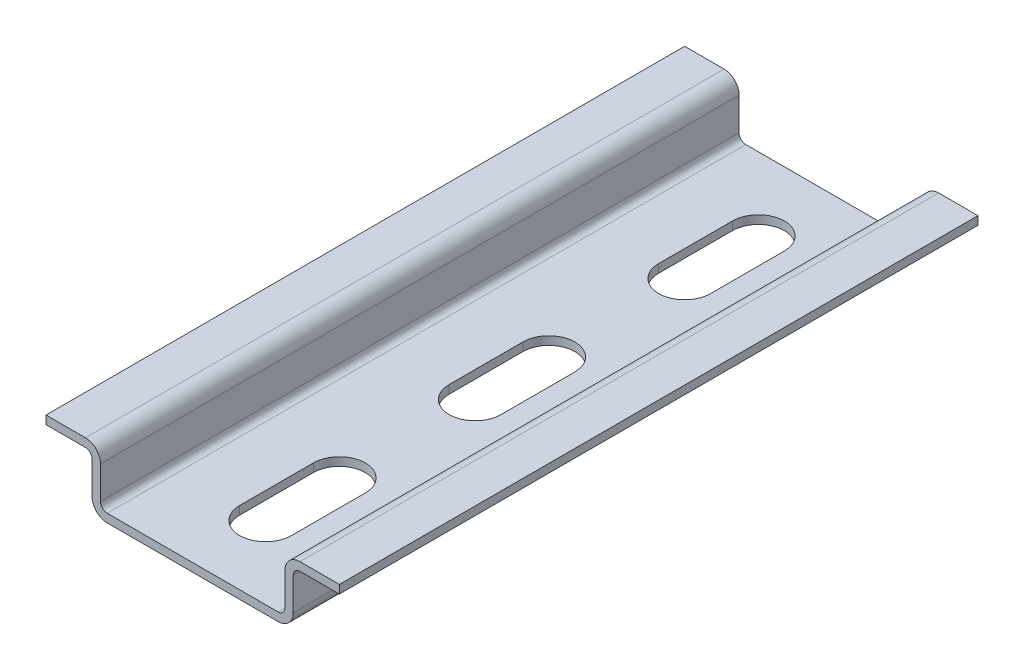
ISO-10303-21;
HEADER;
FILE_DESCRIPTION(('STEP AP214'),'2;1');
FILE_NAME('part.step','',(''),(''),'','','');
FILE_SCHEMA(('AUTOMOTIVE_DESIGN { 1 0 10303 214 1 1 1 1 }'));
ENDSEC;
DATA;
#1=APPLICATION_CONTEXT('core data for automotive mechanical design processes');
#2=APPLICATION_PROTOCOL_DEFINITION('international standard','automotive_design',2000,#1);
#3=PRODUCT_CONTEXT('',#1,'mechanical');
#4=PRODUCT('Part','Part','',(#3));
#5=PRODUCT_RELATED_PRODUCT_CATEGORY('part','',(#4));
#6=PRODUCT_DEFINITION_FORMATION('','',#4);
#7=PRODUCT_DEFINITION_CONTEXT('part definition',#1,'design');
#8=PRODUCT_DEFINITION('design','',#6,#7);
#9=PRODUCT_DEFINITION_SHAPE('','',#8);
#10=(LENGTH_UNIT() NAMED_UNIT(*) SI_UNIT(.MILLI.,.METRE.));
#11=(NAMED_UNIT(*) PLANE_ANGLE_UNIT() SI_UNIT($,.RADIAN.));
#12=(NAMED_UNIT(*) SI_UNIT($,.STERADIAN.) SOLID_ANGLE_UNIT());
#13=UNCERTAINTY_MEASURE_WITH_UNIT(LENGTH_MEASURE(1.E-05),#10,'distance_accuracy_value','');
#14=(GEOMETRIC_REPRESENTATION_CONTEXT(3) GLOBAL_UNCERTAINTY_ASSIGNED_CONTEXT((#13)) GLOBAL_UNIT_ASSIGNED_CONTEXT((#10,
#11,#12)) REPRESENTATION_CONTEXT('',''));
#15=CARTESIAN_POINT('',(0.,0.,0.));
#16=DIRECTION('',(0.,0.,1.));
#17=DIRECTION('',(1.,0.,0.));
#18=AXIS2_PLACEMENT_3D('',#15,#16,#17);
#19=CARTESIAN_POINT('',(-12.,1.00000000000003,-254.));
#20=DIRECTION('',(0.,1.,0.));
#21=DIRECTION('',(-1.,0.,0.));
#22=AXIS2_PLACEMENT_3D('',#19,#20,#21);
#23=PLANE('',#22);
#24=CARTESIAN_POINT('',(0.,1.00000000000001,-4.4));
#25=DIRECTION('',(0.,1.,0.));
#26=DIRECTION('',(1.,0.,0.));
#27=AXIS2_PLACEMENT_3D('',#24,#25,#26);
#28=CIRCLE('',#27,3.1);
#29=CARTESIAN_POINT('',(3.1,1.00000000000001,-4.4));
#30=VERTEX_POINT('',#29);
#31=CARTESIAN_POINT('',(-3.1,1.00000000000002,-4.39999999999999));
#32=VERTEX_POINT('',#31);
#33=EDGE_CURVE('E425',#30,#32,#28,.T.);
#34=ORIENTED_EDGE('',*,*,#33,.F.);
#35=DIRECTION('',(0.,0.,-1.));
#36=VECTOR('',#35,1.);
#37=CARTESIAN_POINT('',(3.1,1.00000000000001,-4.4));
#38=LINE('',#37,#36);
#39=CARTESIAN_POINT('',(3.1,1.00000000000001,4.4));
#40=VERTEX_POINT('',#39);
#41=EDGE_CURVE('E436',#40,#30,#38,.T.);
#42=ORIENTED_EDGE('',*,*,#41,.F.);
#43=CARTESIAN_POINT('',(0.,1.00000000000001,4.4));
#44=DIRECTION('',(0.,1.,0.));
#45=DIRECTION('',(-1.,0.,0.));
#46=AXIS2_PLACEMENT_3D('',#43,#44,#45);
#47=CIRCLE('',#46,3.1);
#48=CARTESIAN_POINT('',(-3.1,1.00000000000002,4.4));
#49=VERTEX_POINT('',#48);
#50=EDGE_CURVE('E450',#49,#40,#47,.T.);
#51=ORIENTED_EDGE('',*,*,#50,.F.);
#52=DIRECTION('',(0.,0.,1.));
#53=VECTOR('',#52,1.);
#54=CARTESIAN_POINT('',(-3.1,1.00000000000002,4.4));
#55=LINE('',#54,#53);
#56=EDGE_CURVE('E447',#32,#49,#55,.T.);
#57=ORIENTED_EDGE('',*,*,#56,.F.);
#58=EDGE_LOOP('',(#34,#42,#51,#57));
#59=FACE_BOUND('',#58,.T.);
#60=CARTESIAN_POINT('',(0.,1.00000000000001,-29.4));
#61=DIRECTION('',(0.,1.,0.));
#62=DIRECTION('',(1.,0.,0.));
#63=AXIS2_PLACEMENT_3D('',#60,#61,#62);
#64=CIRCLE('',#63,3.1);
#65=CARTESIAN_POINT('',(3.1,1.00000000000001,-29.4));
#66=VERTEX_POINT('',#65);
#67=CARTESIAN_POINT('',(-3.1,1.00000000000002,-29.4));
#68=VERTEX_POINT('',#67);
#69=EDGE_CURVE('E393',#66,#68,#64,.T.);
#70=ORIENTED_EDGE('',*,*,#69,.F.);
#71=DIRECTION('',(0.,0.,-1.));
#72=VECTOR('',#71,1.);
#73=CARTESIAN_POINT('',(3.1,1.00000000000001,-29.4));
#74=LINE('',#73,#72);
#75=CARTESIAN_POINT('',(3.1,1.00000000000001,-20.6));
#76=VERTEX_POINT('',#75);
#77=EDGE_CURVE('E404',#76,#66,#74,.T.);
#78=ORIENTED_EDGE('',*,*,#77,.F.);
#79=CARTESIAN_POINT('',(0.,1.00000000000001,-20.6));
#80=DIRECTION('',(0.,1.,0.));
#81=DIRECTION('',(-1.,0.,0.));
#82=AXIS2_PLACEMENT_3D('',#79,#80,#81);
#83=CIRCLE('',#82,3.1);
#84=CARTESIAN_POINT('',(-3.1,1.00000000000002,-20.6));
#85=VERTEX_POINT('',#84);
#86=EDGE_CURVE('E418',#85,#76,#83,.T.);
#87=ORIENTED_EDGE('',*,*,#86,.F.);
#88=DIRECTION('',(0.,0.,1.));
#89=VECTOR('',#88,1.);
#90=CARTESIAN_POINT('',(-3.1,1.00000000000002,-20.6));
#91=LINE('',#90,#89);
#92=EDGE_CURVE('E415',#68,#85,#91,.T.);
#93=ORIENTED_EDGE('',*,*,#92,.F.);
#94=EDGE_LOOP('',(#70,#78,#87,#93));
#95=FACE_BOUND('',#94,.T.);
#96=DIRECTION('',(0.,0.,1.));
#97=VECTOR('',#96,1.);
#98=CARTESIAN_POINT('',(3.1,1.00000000000001,29.4));
#99=LINE('',#98,#97);
#100=CARTESIAN_POINT('',(3.1,1.00000000000001,20.6));
#101=VERTEX_POINT('',#100);
#102=CARTESIAN_POINT('',(3.1,1.00000000000001,29.4));
#103=VERTEX_POINT('',#102);
#104=EDGE_CURVE('E382',#101,#103,#99,.T.);
#105=ORIENTED_EDGE('',*,*,#104,.T.);
#106=CARTESIAN_POINT('',(0.,1.00000000000001,29.4));
#107=DIRECTION('',(0.,-1.,0.));
#108=DIRECTION('',(1.,0.,0.));
#109=AXIS2_PLACEMENT_3D('',#106,#107,#108);
#110=CIRCLE('',#109,3.1);
#111=CARTESIAN_POINT('',(-3.1,1.00000000000002,29.4));
#112=VERTEX_POINT('',#111);
#113=EDGE_CURVE('E368',#103,#112,#110,.T.);
#114=ORIENTED_EDGE('',*,*,#113,.T.);
#115=DIRECTION('',(0.,0.,-1.));
#116=VECTOR('',#115,1.);
#117=CARTESIAN_POINT('',(-3.1,1.00000000000002,20.6));
#118=LINE('',#117,#116);
#119=CARTESIAN_POINT('',(-3.1,1.00000000000002,20.6));
#120=VERTEX_POINT('',#119);
#121=EDGE_CURVE('E372',#112,#120,#118,.T.);
#122=ORIENTED_EDGE('',*,*,#121,.T.);
#123=CARTESIAN_POINT('',(0.,1.00000000000001,20.6));
#124=DIRECTION('',(0.,-1.,0.));
#125=DIRECTION('',(-1.,0.,0.));
#126=AXIS2_PLACEMENT_3D('',#123,#124,#125);
#127=CIRCLE('',#126,3.1);
#128=EDGE_CURVE('E385',#120,#101,#127,.T.);
#129=ORIENTED_EDGE('',*,*,#128,.T.);
#130=EDGE_LOOP('',(#105,#114,#122,#129));
#131=FACE_BOUND('',#130,.T.);
#132=DIRECTION('',(0.,0.,1.));
#133=VECTOR('',#132,1.);
#134=CARTESIAN_POINT('',(-10.2,1.00000000000003,254.));
#135=LINE('',#134,#133);
#136=CARTESIAN_POINT('',(-10.2,1.00000000000003,-38.1));
#137=VERTEX_POINT('',#136);
#138=CARTESIAN_POINT('',(-10.2,1.00000000000003,38.1));
#139=VERTEX_POINT('',#138);
#140=EDGE_CURVE('E488',#137,#139,#135,.T.);
#141=ORIENTED_EDGE('',*,*,#140,.T.);
#142=DIRECTION('',(1.,0.,0.));
#143=VECTOR('',#142,1.);
#144=CARTESIAN_POINT('',(-12.,1.00000000000003,38.1));
#145=LINE('',#144,#143);
#146=CARTESIAN_POINT('',(10.2,1.,38.1));
#147=VERTEX_POINT('',#146);
#148=EDGE_CURVE('E341',#139,#147,#145,.T.);
#149=ORIENTED_EDGE('',*,*,#148,.T.);
#150=DIRECTION('',(0.,0.,1.));
#151=VECTOR('',#150,1.);
#152=CARTESIAN_POINT('',(10.2,1.,-254.));
#153=LINE('',#152,#151);
#154=CARTESIAN_POINT('',(10.2,1.,-38.1));
#155=VERTEX_POINT('',#154);
#156=EDGE_CURVE('E491',#147,#155,#153,.F.);
#157=ORIENTED_EDGE('',*,*,#156,.T.);
#158=DIRECTION('',(-1.,0.,0.));
#159=VECTOR('',#158,1.);
#160=CARTESIAN_POINT('',(-12.,1.00000000000003,-38.1));
#161=LINE('',#160,#159);
#162=EDGE_CURVE('E307',#155,#137,#161,.T.);
#163=ORIENTED_EDGE('',*,*,#162,.T.);
#164=EDGE_LOOP('',(#141,#149,#157,#163));
#165=FACE_BOUND('',#164,.T.);
#166=ADVANCED_FACE('F34',(#59,#95,#131,#165),#23,.T.);
#167=CARTESIAN_POINT('',(-12.,0.,-254.));
#168=DIRECTION('',(0.,1.,0.));
#169=DIRECTION('',(-1.,0.,0.));
#170=AXIS2_PLACEMENT_3D('',#167,#168,#169);
#171=PLANE('',#170);
#172=DIRECTION('',(0.,0.,-1.));
#173=VECTOR('',#172,1.);
#174=CARTESIAN_POINT('',(3.1,0.,-4.4));
#175=LINE('',#174,#173);
#176=CARTESIAN_POINT('',(3.1,0.,4.4));
#177=VERTEX_POINT('',#176);
#178=CARTESIAN_POINT('',(3.1,0.,-4.4));
#179=VERTEX_POINT('',#178);
#180=EDGE_CURVE('E442',#177,#179,#175,.T.);
#181=ORIENTED_EDGE('',*,*,#180,.T.);
#182=CARTESIAN_POINT('',(0.,0.,-4.4));
#183=DIRECTION('',(0.,1.,0.));
#184=DIRECTION('',(1.,0.,0.));
#185=AXIS2_PLACEMENT_3D('',#182,#183,#184);
#186=CIRCLE('',#185,3.1);
#187=CARTESIAN_POINT('',(-3.1,0.,-4.4));
#188=VERTEX_POINT('',#187);
#189=EDGE_CURVE('E432',#179,#188,#186,.T.);
#190=ORIENTED_EDGE('',*,*,#189,.T.);
#191=DIRECTION('',(0.,0.,1.));
#192=VECTOR('',#191,1.);
#193=CARTESIAN_POINT('',(-3.1,0.,4.4));
#194=LINE('',#193,#192);
#195=CARTESIAN_POINT('',(-3.1,0.,4.40000000000001));
#196=VERTEX_POINT('',#195);
#197=EDGE_CURVE('E435',#188,#196,#194,.T.);
#198=ORIENTED_EDGE('',*,*,#197,.T.);
#199=CARTESIAN_POINT('',(0.,0.,4.4));
#200=DIRECTION('',(0.,1.,0.));
#201=DIRECTION('',(-1.,0.,0.));
#202=AXIS2_PLACEMENT_3D('',#199,#200,#201);
#203=CIRCLE('',#202,3.1);
#204=EDGE_CURVE('E439',#196,#177,#203,.T.);
#205=ORIENTED_EDGE('',*,*,#204,.T.);
#206=EDGE_LOOP('',(#181,#190,#198,#205));
#207=FACE_BOUND('',#206,.T.);
#208=DIRECTION('',(0.,0.,-1.));
#209=VECTOR('',#208,1.);
#210=CARTESIAN_POINT('',(3.1,0.,-29.4));
#211=LINE('',#210,#209);
#212=CARTESIAN_POINT('',(3.1,0.,-20.6));
#213=VERTEX_POINT('',#212);
#214=CARTESIAN_POINT('',(3.1,0.,-29.4));
#215=VERTEX_POINT('',#214);
#216=EDGE_CURVE('E410',#213,#215,#211,.T.);
#217=ORIENTED_EDGE('',*,*,#216,.T.);
#218=CARTESIAN_POINT('',(0.,0.,-29.4));
#219=DIRECTION('',(0.,1.,0.));
#220=DIRECTION('',(1.,0.,0.));
#221=AXIS2_PLACEMENT_3D('',#218,#219,#220);
#222=CIRCLE('',#221,3.1);
#223=CARTESIAN_POINT('',(-3.1,0.,-29.4));
#224=VERTEX_POINT('',#223);
#225=EDGE_CURVE('E400',#215,#224,#222,.T.);
#226=ORIENTED_EDGE('',*,*,#225,.T.);
#227=DIRECTION('',(0.,0.,1.));
#228=VECTOR('',#227,1.);
#229=CARTESIAN_POINT('',(-3.1,0.,-20.6));
#230=LINE('',#229,#228);
#231=CARTESIAN_POINT('',(-3.1,0.,-20.6));
#232=VERTEX_POINT('',#231);
#233=EDGE_CURVE('E403',#224,#232,#230,.T.);
#234=ORIENTED_EDGE('',*,*,#233,.T.);
#235=CARTESIAN_POINT('',(0.,0.,-20.6));
#236=DIRECTION('',(0.,1.,0.));
#237=DIRECTION('',(-1.,0.,0.));
#238=AXIS2_PLACEMENT_3D('',#235,#236,#237);
#239=CIRCLE('',#238,3.1);
#240=EDGE_CURVE('E407',#232,#213,#239,.T.);
#241=ORIENTED_EDGE('',*,*,#240,.T.);
#242=EDGE_LOOP('',(#217,#226,#234,#241));
#243=FACE_BOUND('',#242,.T.);
#244=CARTESIAN_POINT('',(0.,0.,29.4));
#245=DIRECTION('',(0.,-1.,0.));
#246=DIRECTION('',(1.,0.,0.));
#247=AXIS2_PLACEMENT_3D('',#244,#245,#246);
#248=CIRCLE('',#247,3.1);
#249=CARTESIAN_POINT('',(3.1,0.,29.4));
#250=VERTEX_POINT('',#249);
#251=CARTESIAN_POINT('',(-3.1,0.,29.4));
#252=VERTEX_POINT('',#251);
#253=EDGE_CURVE('E369',#250,#252,#248,.T.);
#254=ORIENTED_EDGE('',*,*,#253,.F.);
#255=DIRECTION('',(0.,0.,1.));
#256=VECTOR('',#255,1.);
#257=CARTESIAN_POINT('',(3.1,0.,29.4));
#258=LINE('',#257,#256);
#259=CARTESIAN_POINT('',(3.1,0.,20.6));
#260=VERTEX_POINT('',#259);
#261=EDGE_CURVE('E371',#260,#250,#258,.T.);
#262=ORIENTED_EDGE('',*,*,#261,.F.);
#263=CARTESIAN_POINT('',(0.,0.,20.6));
#264=DIRECTION('',(0.,-1.,0.));
#265=DIRECTION('',(-1.,0.,0.));
#266=AXIS2_PLACEMENT_3D('',#263,#264,#265);
#267=CIRCLE('',#266,3.1);
#268=CARTESIAN_POINT('',(-3.1,0.,20.6));
#269=VERTEX_POINT('',#268);
#270=EDGE_CURVE('E374',#269,#260,#267,.T.);
#271=ORIENTED_EDGE('',*,*,#270,.F.);
#272=DIRECTION('',(0.,0.,-1.));
#273=VECTOR('',#272,1.);
#274=CARTESIAN_POINT('',(-3.1,0.,20.6));
#275=LINE('',#274,#273);
#276=EDGE_CURVE('E377',#252,#269,#275,.T.);
#277=ORIENTED_EDGE('',*,*,#276,.F.);
#278=EDGE_LOOP('',(#254,#262,#271,#277));
#279=FACE_BOUND('',#278,.T.);
#280=DIRECTION('',(1.,0.,0.));
#281=VECTOR('',#280,1.);
#282=CARTESIAN_POINT('',(51.2266068298276,0.,38.1));
#283=LINE('',#282,#281);
#284=CARTESIAN_POINT('',(-10.2,0.,38.1));
#285=VERTEX_POINT('',#284);
#286=CARTESIAN_POINT('',(10.2,0.,38.1));
#287=VERTEX_POINT('',#286);
#288=EDGE_CURVE('E243',#285,#287,#283,.T.);
#289=ORIENTED_EDGE('',*,*,#288,.F.);
#290=DIRECTION('',(0.,0.,1.));
#291=VECTOR('',#290,1.);
#292=CARTESIAN_POINT('',(-10.2,0.,-254.));
#293=LINE('',#292,#291);
#294=CARTESIAN_POINT('',(-10.2,0.,-38.1));
#295=VERTEX_POINT('',#294);
#296=EDGE_CURVE('E258',#285,#295,#293,.F.);
#297=ORIENTED_EDGE('',*,*,#296,.T.);
#298=DIRECTION('',(-1.,0.,0.));
#299=VECTOR('',#298,1.);
#300=CARTESIAN_POINT('',(51.2266068298276,0.,-38.1));
#301=LINE('',#300,#299);
#302=CARTESIAN_POINT('',(10.2,0.,-38.1));
#303=VERTEX_POINT('',#302);
#304=EDGE_CURVE('E262',#303,#295,#301,.T.);
#305=ORIENTED_EDGE('',*,*,#304,.F.);
#306=DIRECTION('',(0.,0.,1.));
#307=VECTOR('',#306,1.);
#308=CARTESIAN_POINT('',(10.2,0.,-254.));
#309=LINE('',#308,#307);
#310=EDGE_CURVE('E260',#303,#287,#309,.T.);
#311=ORIENTED_EDGE('',*,*,#310,.T.);
#312=EDGE_LOOP('',(#289,#297,#305,#311));
#313=FACE_BOUND('',#312,.T.);
#314=ADVANCED_FACE('F256',(#207,#243,#279,#313),#171,.F.);
#315=CARTESIAN_POINT('',(-12.,7.50000000000003,-254.));
#316=DIRECTION('',(0.,1.,0.));
#317=DIRECTION('',(-1.,0.,0.));
#318=AXIS2_PLACEMENT_3D('',#315,#316,#317);
#319=PLANE('',#318);
#320=DIRECTION('',(0.,0.,1.));
#321=VECTOR('',#320,1.);
#322=CARTESIAN_POINT('',(-17.5,7.50000000000003,-254.));
#323=LINE('',#322,#321);
#324=CARTESIAN_POINT('',(-17.5,7.5,-38.1));
#325=VERTEX_POINT('',#324);
#326=CARTESIAN_POINT('',(-17.5,7.5,38.1));
#327=VERTEX_POINT('',#326);
#328=EDGE_CURVE('E295',#325,#327,#323,.T.);
#329=ORIENTED_EDGE('',*,*,#328,.T.);
#330=DIRECTION('',(1.,0.,0.));
#331=VECTOR('',#330,1.);
#332=CARTESIAN_POINT('',(51.2266068298276,7.49999999999999,38.1));
#333=LINE('',#332,#331);
#334=CARTESIAN_POINT('',(-12.8,7.5,38.1));
#335=VERTEX_POINT('',#334);
#336=EDGE_CURVE('E294',#327,#335,#333,.T.);
#337=ORIENTED_EDGE('',*,*,#336,.T.);
#338=DIRECTION('',(0.,0.,1.));
#339=VECTOR('',#338,1.);
#340=CARTESIAN_POINT('',(-12.8,7.50000000000003,-254.));
#341=LINE('',#340,#339);
#342=CARTESIAN_POINT('',(-12.8,7.50000000000003,-38.1));
#343=VERTEX_POINT('',#342);
#344=EDGE_CURVE('E283',#335,#343,#341,.F.);
#345=ORIENTED_EDGE('',*,*,#344,.T.);
#346=DIRECTION('',(-1.,0.,0.));
#347=VECTOR('',#346,1.);
#348=CARTESIAN_POINT('',(51.2266068298276,7.49999999999999,-38.1));
#349=LINE('',#348,#347);
#350=EDGE_CURVE('E56',#343,#325,#349,.T.);
#351=ORIENTED_EDGE('',*,*,#350,.T.);
#352=EDGE_LOOP('',(#329,#337,#345,#351));
#353=FACE_BOUND('',#352,.T.);
#354=ADVANCED_FACE('F292',(#353),#319,.T.);
#355=CARTESIAN_POINT('',(-11.,0.,-254.));
#356=DIRECTION('',(1.,0.,0.));
#357=DIRECTION('',(0.,0.,-1.));
#358=AXIS2_PLACEMENT_3D('',#355,#356,#357);
#359=PLANE('',#358);
#360=DIRECTION('',(0.,0.,1.));
#361=VECTOR('',#360,1.);
#362=CARTESIAN_POINT('',(-11.,5.70000000000003,-254.));
#363=LINE('',#362,#361);
#364=CARTESIAN_POINT('',(-11.,5.70000000000003,-38.1));
#365=VERTEX_POINT('',#364);
#366=CARTESIAN_POINT('',(-11.,5.70000000000003,38.1));
#367=VERTEX_POINT('',#366);
#368=EDGE_CURVE('E280',#365,#367,#363,.T.);
#369=ORIENTED_EDGE('',*,*,#368,.T.);
#370=DIRECTION('',(0.,-1.,0.));
#371=VECTOR('',#370,1.);
#372=CARTESIAN_POINT('',(-11.,0.,38.1));
#373=LINE('',#372,#371);
#374=CARTESIAN_POINT('',(-11.,1.80000000000003,38.1));
#375=VERTEX_POINT('',#374);
#376=EDGE_CURVE('E49',#367,#375,#373,.T.);
#377=ORIENTED_EDGE('',*,*,#376,.T.);
#378=DIRECTION('',(0.,0.,1.));
#379=VECTOR('',#378,1.);
#380=CARTESIAN_POINT('',(-11.,1.80000000000003,-254.));
#381=LINE('',#380,#379);
#382=CARTESIAN_POINT('',(-11.,1.80000000000003,-38.1));
#383=VERTEX_POINT('',#382);
#384=EDGE_CURVE('E494',#375,#383,#381,.F.);
#385=ORIENTED_EDGE('',*,*,#384,.T.);
#386=DIRECTION('',(0.,1.,0.));
#387=VECTOR('',#386,1.);
#388=CARTESIAN_POINT('',(-11.,0.,-38.1));
#389=LINE('',#388,#387);
#390=EDGE_CURVE('E261',#383,#365,#389,.T.);
#391=ORIENTED_EDGE('',*,*,#390,.T.);
#392=EDGE_LOOP('',(#369,#377,#385,#391));
#393=FACE_BOUND('',#392,.T.);
#394=ADVANCED_FACE('F521',(#393),#359,.T.);
#395=CARTESIAN_POINT('',(11.,0.,-254.));
#396=DIRECTION('',(-1.,0.,0.));
#397=DIRECTION('',(0.,0.,1.));
#398=AXIS2_PLACEMENT_3D('',#395,#396,#397);
#399=PLANE('',#398);
#400=DIRECTION('',(0.,0.,1.));
#401=VECTOR('',#400,1.);
#402=CARTESIAN_POINT('',(11.,1.8,254.));
#403=LINE('',#402,#401);
#404=CARTESIAN_POINT('',(11.,1.8,-38.1));
#405=VERTEX_POINT('',#404);
#406=CARTESIAN_POINT('',(11.,1.8,38.1));
#407=VERTEX_POINT('',#406);
#408=EDGE_CURVE('E485',#405,#407,#403,.T.);
#409=ORIENTED_EDGE('',*,*,#408,.T.);
#410=DIRECTION('',(0.,1.,0.));
#411=VECTOR('',#410,1.);
#412=CARTESIAN_POINT('',(11.,0.,38.1));
#413=LINE('',#412,#411);
#414=CARTESIAN_POINT('',(11.,5.7,38.1));
#415=VERTEX_POINT('',#414);
#416=EDGE_CURVE('E346',#407,#415,#413,.T.);
#417=ORIENTED_EDGE('',*,*,#416,.T.);
#418=DIRECTION('',(0.,0.,1.));
#419=VECTOR('',#418,1.);
#420=CARTESIAN_POINT('',(11.,5.7,-254.));
#421=LINE('',#420,#419);
#422=CARTESIAN_POINT('',(11.,5.7,-38.1));
#423=VERTEX_POINT('',#422);
#424=EDGE_CURVE('E267',#415,#423,#421,.F.);
#425=ORIENTED_EDGE('',*,*,#424,.T.);
#426=DIRECTION('',(0.,-1.,0.));
#427=VECTOR('',#426,1.);
#428=CARTESIAN_POINT('',(11.,0.,-38.1));
#429=LINE('',#428,#427);
#430=EDGE_CURVE('E312',#423,#405,#429,.T.);
#431=ORIENTED_EDGE('',*,*,#430,.T.);
#432=EDGE_LOOP('',(#409,#417,#425,#431));
#433=FACE_BOUND('',#432,.T.);
#434=ADVANCED_FACE('F507',(#433),#399,.T.);
#435=CARTESIAN_POINT('',(12.,7.5,-254.));
#436=DIRECTION('',(0.,1.,0.));
#437=DIRECTION('',(-1.,0.,0.));
#438=AXIS2_PLACEMENT_3D('',#435,#436,#437);
#439=PLANE('',#438);
#440=DIRECTION('',(0.,0.,1.));
#441=VECTOR('',#440,1.);
#442=CARTESIAN_POINT('',(12.8,7.5,-254.));
#443=LINE('',#442,#441);
#444=CARTESIAN_POINT('',(12.8,7.5,-38.1));
#445=VERTEX_POINT('',#444);
#446=CARTESIAN_POINT('',(12.8,7.5,38.1));
#447=VERTEX_POINT('',#446);
#448=EDGE_CURVE('E272',#445,#447,#443,.T.);
#449=ORIENTED_EDGE('',*,*,#448,.T.);
#450=CARTESIAN_POINT('',(17.5,7.5,38.1));
#451=VERTEX_POINT('',#450);
#452=EDGE_CURVE('E297',#447,#451,#333,.T.);
#453=ORIENTED_EDGE('',*,*,#452,.T.);
#454=DIRECTION('',(0.,0.,1.));
#455=VECTOR('',#454,1.);
#456=CARTESIAN_POINT('',(17.5,7.5,-254.));
#457=LINE('',#456,#455);
#458=CARTESIAN_POINT('',(17.5,7.5,-38.1));
#459=VERTEX_POINT('',#458);
#460=EDGE_CURVE('E463',#459,#451,#457,.T.);
#461=ORIENTED_EDGE('',*,*,#460,.F.);
#462=EDGE_CURVE('E301',#459,#445,#349,.T.);
#463=ORIENTED_EDGE('',*,*,#462,.T.);
#464=EDGE_LOOP('',(#449,#453,#461,#463));
#465=FACE_BOUND('',#464,.T.);
#466=ADVANCED_FACE('F500',(#465),#439,.T.);
#467=CARTESIAN_POINT('',(17.5,7.5,-254.));
#468=DIRECTION('',(-1.,0.,0.));
#469=DIRECTION('',(0.,0.,1.));
#470=AXIS2_PLACEMENT_3D('',#467,#468,#469);
#471=PLANE('',#470);
#472=DIRECTION('',(0.,1.,0.));
#473=VECTOR('',#472,1.);
#474=CARTESIAN_POINT('',(17.5,7.5,38.1));
#475=LINE('',#474,#473);
#476=CARTESIAN_POINT('',(17.5,6.5,38.1));
#477=VERTEX_POINT('',#476);
#478=EDGE_CURVE('E366',#477,#451,#475,.T.);
#479=ORIENTED_EDGE('',*,*,#478,.F.);
#480=DIRECTION('',(0.,0.,1.));
#481=VECTOR('',#480,1.);
#482=CARTESIAN_POINT('',(17.5,6.5,-254.));
#483=LINE('',#482,#481);
#484=CARTESIAN_POINT('',(17.5,6.5,-38.1));
#485=VERTEX_POINT('',#484);
#486=EDGE_CURVE('E467',#485,#477,#483,.T.);
#487=ORIENTED_EDGE('',*,*,#486,.F.);
#488=DIRECTION('',(0.,-1.,0.));
#489=VECTOR('',#488,1.);
#490=CARTESIAN_POINT('',(17.5,7.5,-38.1));
#491=LINE('',#490,#489);
#492=EDGE_CURVE('E336',#459,#485,#491,.T.);
#493=ORIENTED_EDGE('',*,*,#492,.F.);
#494=ORIENTED_EDGE('',*,*,#460,.T.);
#495=EDGE_LOOP('',(#479,#487,#493,#494));
#496=FACE_BOUND('',#495,.T.);
#497=ADVANCED_FACE('F528',(#496),#471,.F.);
#498=CARTESIAN_POINT('',(12.,6.5,-254.));
#499=DIRECTION('',(0.,1.,0.));
#500=DIRECTION('',(-1.,0.,0.));
#501=AXIS2_PLACEMENT_3D('',#498,#499,#500);
#502=PLANE('',#501);
#503=DIRECTION('',(1.,0.,0.));
#504=VECTOR('',#503,1.);
#505=CARTESIAN_POINT('',(12.,6.5,38.1));
#506=LINE('',#505,#504);
#507=CARTESIAN_POINT('',(12.8,6.5,38.1));
#508=VERTEX_POINT('',#507);
#509=EDGE_CURVE('E364',#508,#477,#506,.T.);
#510=ORIENTED_EDGE('',*,*,#509,.F.);
#511=DIRECTION('',(0.,0.,1.));
#512=VECTOR('',#511,1.);
#513=CARTESIAN_POINT('',(12.8,6.5,-254.));
#514=LINE('',#513,#512);
#515=CARTESIAN_POINT('',(12.8,6.5,-38.1));
#516=VERTEX_POINT('',#515);
#517=EDGE_CURVE('E476',#508,#516,#514,.F.);
#518=ORIENTED_EDGE('',*,*,#517,.T.);
#519=DIRECTION('',(-1.,0.,0.));
#520=VECTOR('',#519,1.);
#521=CARTESIAN_POINT('',(12.,6.5,-38.1));
#522=LINE('',#521,#520);
#523=EDGE_CURVE('E334',#485,#516,#522,.T.);
#524=ORIENTED_EDGE('',*,*,#523,.F.);
#525=ORIENTED_EDGE('',*,*,#486,.T.);
#526=EDGE_LOOP('',(#510,#518,#524,#525));
#527=FACE_BOUND('',#526,.T.);
#528=ADVANCED_FACE('F531',(#527),#502,.F.);
#529=CARTESIAN_POINT('',(12.,0.,-254.));
#530=DIRECTION('',(-1.,0.,0.));
#531=DIRECTION('',(0.,0.,1.));
#532=AXIS2_PLACEMENT_3D('',#529,#530,#531);
#533=PLANE('',#532);
#534=DIRECTION('',(0.,1.,0.));
#535=VECTOR('',#534,1.);
#536=CARTESIAN_POINT('',(12.,0.,38.1));
#537=LINE('',#536,#535);
#538=CARTESIAN_POINT('',(12.,1.8,38.1));
#539=VERTEX_POINT('',#538);
#540=CARTESIAN_POINT('',(12.,5.7,38.1));
#541=VERTEX_POINT('',#540);
#542=EDGE_CURVE('E360',#539,#541,#537,.T.);
#543=ORIENTED_EDGE('',*,*,#542,.F.);
#544=DIRECTION('',(0.,0.,1.));
#545=VECTOR('',#544,1.);
#546=CARTESIAN_POINT('',(12.,1.8,-254.));
#547=LINE('',#546,#545);
#548=CARTESIAN_POINT('',(12.,1.8,-38.1));
#549=VERTEX_POINT('',#548);
#550=EDGE_CURVE('E269',#539,#549,#547,.F.);
#551=ORIENTED_EDGE('',*,*,#550,.T.);
#552=DIRECTION('',(0.,-1.,0.));
#553=VECTOR('',#552,1.);
#554=CARTESIAN_POINT('',(12.,0.,-38.1));
#555=LINE('',#554,#553);
#556=CARTESIAN_POINT('',(12.,5.7,-38.1));
#557=VERTEX_POINT('',#556);
#558=EDGE_CURVE('E330',#557,#549,#555,.T.);
#559=ORIENTED_EDGE('',*,*,#558,.F.);
#560=DIRECTION('',(0.,0.,1.));
#561=VECTOR('',#560,1.);
#562=CARTESIAN_POINT('',(12.,5.7,254.));
#563=LINE('',#562,#561);
#564=EDGE_CURVE('E466',#557,#541,#563,.T.);
#565=ORIENTED_EDGE('',*,*,#564,.T.);
#566=EDGE_LOOP('',(#543,#551,#559,#565));
#567=FACE_BOUND('',#566,.T.);
#568=ADVANCED_FACE('F541',(#567),#533,.F.);
#569=CARTESIAN_POINT('',(-12.,0.,-254.));
#570=DIRECTION('',(1.,0.,0.));
#571=DIRECTION('',(0.,0.,-1.));
#572=AXIS2_PLACEMENT_3D('',#569,#570,#571);
#573=PLANE('',#572);
#574=DIRECTION('',(0.,-1.,0.));
#575=VECTOR('',#574,1.);
#576=CARTESIAN_POINT('',(-12.,0.,38.1));
#577=LINE('',#576,#575);
#578=CARTESIAN_POINT('',(-12.,5.70000000000003,38.1));
#579=VERTEX_POINT('',#578);
#580=CARTESIAN_POINT('',(-12.,1.80000000000003,38.1));
#581=VERTEX_POINT('',#580);
#582=EDGE_CURVE('E246',#579,#581,#577,.T.);
#583=ORIENTED_EDGE('',*,*,#582,.F.);
#584=DIRECTION('',(0.,0.,1.));
#585=VECTOR('',#584,1.);
#586=CARTESIAN_POINT('',(-12.,5.70000000000003,-254.));
#587=LINE('',#586,#585);
#588=CARTESIAN_POINT('',(-12.,5.70000000000003,-38.1));
#589=VERTEX_POINT('',#588);
#590=EDGE_CURVE('E482',#579,#589,#587,.F.);
#591=ORIENTED_EDGE('',*,*,#590,.T.);
#592=DIRECTION('',(0.,1.,0.));
#593=VECTOR('',#592,1.);
#594=CARTESIAN_POINT('',(-12.,0.,-38.1));
#595=LINE('',#594,#593);
#596=CARTESIAN_POINT('',(-12.,1.80000000000003,-38.1));
#597=VERTEX_POINT('',#596);
#598=EDGE_CURVE('E319',#597,#589,#595,.T.);
#599=ORIENTED_EDGE('',*,*,#598,.F.);
#600=DIRECTION('',(0.,0.,1.));
#601=VECTOR('',#600,1.);
#602=CARTESIAN_POINT('',(-12.,1.80000000000003,-254.));
#603=LINE('',#602,#601);
#604=EDGE_CURVE('E278',#597,#581,#603,.T.);
#605=ORIENTED_EDGE('',*,*,#604,.T.);
#606=EDGE_LOOP('',(#583,#591,#599,#605));
#607=FACE_BOUND('',#606,.T.);
#608=ADVANCED_FACE('F574',(#607),#573,.F.);
#609=CARTESIAN_POINT('',(-12.,6.50000000000003,-254.));
#610=DIRECTION('',(0.,1.,0.));
#611=DIRECTION('',(-1.,0.,0.));
#612=AXIS2_PLACEMENT_3D('',#609,#610,#611);
#613=PLANE('',#612);
#614=DIRECTION('',(1.,0.,0.));
#615=VECTOR('',#614,1.);
#616=CARTESIAN_POINT('',(-12.,6.50000000000003,38.1));
#617=LINE('',#616,#615);
#618=CARTESIAN_POINT('',(-17.5,6.50000000000003,38.1));
#619=VERTEX_POINT('',#618);
#620=CARTESIAN_POINT('',(-12.8,6.50000000000003,38.1));
#621=VERTEX_POINT('',#620);
#622=EDGE_CURVE('E354',#619,#621,#617,.T.);
#623=ORIENTED_EDGE('',*,*,#622,.F.);
#624=DIRECTION('',(0.,0.,1.));
#625=VECTOR('',#624,1.);
#626=CARTESIAN_POINT('',(-17.5,6.50000000000003,-254.));
#627=LINE('',#626,#625);
#628=CARTESIAN_POINT('',(-17.5,6.50000000000003,-38.1));
#629=VERTEX_POINT('',#628);
#630=EDGE_CURVE('E470',#629,#619,#627,.T.);
#631=ORIENTED_EDGE('',*,*,#630,.F.);
#632=DIRECTION('',(-1.,0.,0.));
#633=VECTOR('',#632,1.);
#634=CARTESIAN_POINT('',(-12.,6.50000000000003,-38.1));
#635=LINE('',#634,#633);
#636=CARTESIAN_POINT('',(-12.8,6.50000000000003,-38.1));
#637=VERTEX_POINT('',#636);
#638=EDGE_CURVE('E323',#637,#629,#635,.T.);
#639=ORIENTED_EDGE('',*,*,#638,.F.);
#640=DIRECTION('',(0.,0.,1.));
#641=VECTOR('',#640,1.);
#642=CARTESIAN_POINT('',(-12.8,6.50000000000003,254.));
#643=LINE('',#642,#641);
#644=EDGE_CURVE('E479',#637,#621,#643,.T.);
#645=ORIENTED_EDGE('',*,*,#644,.T.);
#646=EDGE_LOOP('',(#623,#631,#639,#645));
#647=FACE_BOUND('',#646,.T.);
#648=ADVANCED_FACE('F578',(#647),#613,.F.);
#649=CARTESIAN_POINT('',(-17.5,6.50000000000003,-254.));
#650=DIRECTION('',(1.,0.,0.));
#651=DIRECTION('',(0.,0.,-1.));
#652=AXIS2_PLACEMENT_3D('',#649,#650,#651);
#653=PLANE('',#652);
#654=DIRECTION('',(0.,-1.,0.));
#655=VECTOR('',#654,1.);
#656=CARTESIAN_POINT('',(-17.5,6.50000000000003,38.1));
#657=LINE('',#656,#655);
#658=EDGE_CURVE('E356',#327,#619,#657,.T.);
#659=ORIENTED_EDGE('',*,*,#658,.F.);
#660=ORIENTED_EDGE('',*,*,#328,.F.);
#661=DIRECTION('',(0.,1.,0.));
#662=VECTOR('',#661,1.);
#663=CARTESIAN_POINT('',(-17.5,6.50000000000003,-38.1));
#664=LINE('',#663,#662);
#665=EDGE_CURVE('E325',#629,#325,#664,.T.);
#666=ORIENTED_EDGE('',*,*,#665,.F.);
#667=ORIENTED_EDGE('',*,*,#630,.T.);
#668=EDGE_LOOP('',(#659,#660,#666,#667));
#669=FACE_BOUND('',#668,.T.);
#670=ADVANCED_FACE('F582',(#669),#653,.F.);
#671=CARTESIAN_POINT('',(12.8,5.7,-254.));
#672=DIRECTION('',(0.,0.,-1.));
#673=DIRECTION('',(-1.,0.,0.));
#674=AXIS2_PLACEMENT_3D('',#671,#672,#673);
#675=CYLINDRICAL_SURFACE('',#674,0.8);
#676=CARTESIAN_POINT('',(12.8,5.7,38.1));
#677=DIRECTION('',(0.,0.,1.));
#678=DIRECTION('',(1.,0.,0.));
#679=AXIS2_PLACEMENT_3D('',#676,#677,#678);
#680=CIRCLE('',#679,0.8);
#681=EDGE_CURVE('E362',#541,#508,#680,.F.);
#682=ORIENTED_EDGE('',*,*,#681,.F.);
#683=ORIENTED_EDGE('',*,*,#564,.F.);
#684=CARTESIAN_POINT('',(12.8,5.7,-38.1));
#685=DIRECTION('',(0.,0.,-1.));
#686=DIRECTION('',(-1.,0.,0.));
#687=AXIS2_PLACEMENT_3D('',#684,#685,#686);
#688=CIRCLE('',#687,0.8);
#689=EDGE_CURVE('E332',#516,#557,#688,.F.);
#690=ORIENTED_EDGE('',*,*,#689,.F.);
#691=ORIENTED_EDGE('',*,*,#517,.F.);
#692=EDGE_LOOP('',(#682,#683,#690,#691));
#693=FACE_BOUND('',#692,.T.);
#694=ADVANCED_FACE('F538',(#693),#675,.F.);
#695=CARTESIAN_POINT('',(-12.8,5.70000000000003,-254.));
#696=DIRECTION('',(0.,0.,-1.));
#697=DIRECTION('',(-1.,0.,0.));
#698=AXIS2_PLACEMENT_3D('',#695,#696,#697);
#699=CYLINDRICAL_SURFACE('',#698,0.8);
#700=CARTESIAN_POINT('',(-12.8,5.70000000000003,38.1));
#701=DIRECTION('',(0.,0.,1.));
#702=DIRECTION('',(1.,0.,0.));
#703=AXIS2_PLACEMENT_3D('',#700,#701,#702);
#704=CIRCLE('',#703,0.8);
#705=EDGE_CURVE('E352',#621,#579,#704,.F.);
#706=ORIENTED_EDGE('',*,*,#705,.F.);
#707=ORIENTED_EDGE('',*,*,#644,.F.);
#708=CARTESIAN_POINT('',(-12.8,5.70000000000003,-38.1));
#709=DIRECTION('',(0.,0.,-1.));
#710=DIRECTION('',(-1.,0.,0.));
#711=AXIS2_PLACEMENT_3D('',#708,#709,#710);
#712=CIRCLE('',#711,0.8);
#713=EDGE_CURVE('E321',#589,#637,#712,.F.);
#714=ORIENTED_EDGE('',*,*,#713,.F.);
#715=ORIENTED_EDGE('',*,*,#590,.F.);
#716=EDGE_LOOP('',(#706,#707,#714,#715));
#717=FACE_BOUND('',#716,.T.);
#718=ADVANCED_FACE('F591',(#717),#699,.F.);
#719=CARTESIAN_POINT('',(10.2,1.8,-254.));
#720=DIRECTION('',(0.,0.,-1.));
#721=DIRECTION('',(-1.,0.,0.));
#722=AXIS2_PLACEMENT_3D('',#719,#720,#721);
#723=CYLINDRICAL_SURFACE('',#722,0.8);
#724=CARTESIAN_POINT('',(10.2,1.8,38.1));
#725=DIRECTION('',(0.,0.,1.));
#726=DIRECTION('',(1.,0.,0.));
#727=AXIS2_PLACEMENT_3D('',#724,#725,#726);
#728=CIRCLE('',#727,0.8);
#729=EDGE_CURVE('E344',#407,#147,#728,.F.);
#730=ORIENTED_EDGE('',*,*,#729,.F.);
#731=ORIENTED_EDGE('',*,*,#408,.F.);
#732=CARTESIAN_POINT('',(10.2,1.8,-38.1));
#733=DIRECTION('',(0.,0.,-1.));
#734=DIRECTION('',(-1.,0.,0.));
#735=AXIS2_PLACEMENT_3D('',#732,#733,#734);
#736=CIRCLE('',#735,0.8);
#737=EDGE_CURVE('E310',#155,#405,#736,.F.);
#738=ORIENTED_EDGE('',*,*,#737,.F.);
#739=ORIENTED_EDGE('',*,*,#156,.F.);
#740=EDGE_LOOP('',(#730,#731,#738,#739));
#741=FACE_BOUND('',#740,.T.);
#742=ADVANCED_FACE('F511',(#741),#723,.F.);
#743=CARTESIAN_POINT('',(-10.2,1.80000000000003,-254.));
#744=DIRECTION('',(0.,0.,-1.));
#745=DIRECTION('',(-1.,0.,0.));
#746=AXIS2_PLACEMENT_3D('',#743,#744,#745);
#747=CYLINDRICAL_SURFACE('',#746,0.8);
#748=CARTESIAN_POINT('',(-10.2,1.80000000000003,38.1));
#749=DIRECTION('',(0.,0.,1.));
#750=DIRECTION('',(1.,0.,0.));
#751=AXIS2_PLACEMENT_3D('',#748,#749,#750);
#752=CIRCLE('',#751,0.8);
#753=EDGE_CURVE('E339',#139,#375,#752,.F.);
#754=ORIENTED_EDGE('',*,*,#753,.F.);
#755=ORIENTED_EDGE('',*,*,#140,.F.);
#756=CARTESIAN_POINT('',(-10.2,1.80000000000003,-38.1));
#757=DIRECTION('',(0.,0.,-1.));
#758=DIRECTION('',(-1.,0.,0.));
#759=AXIS2_PLACEMENT_3D('',#756,#757,#758);
#760=CIRCLE('',#759,0.8);
#761=EDGE_CURVE('E305',#383,#137,#760,.F.);
#762=ORIENTED_EDGE('',*,*,#761,.F.);
#763=ORIENTED_EDGE('',*,*,#384,.F.);
#764=EDGE_LOOP('',(#754,#755,#762,#763));
#765=FACE_BOUND('',#764,.T.);
#766=ADVANCED_FACE('F518',(#765),#747,.F.);
#767=CARTESIAN_POINT('',(12.8,5.7,-254.));
#768=DIRECTION('',(0.,0.,1.));
#769=DIRECTION('',(1.,0.,0.));
#770=AXIS2_PLACEMENT_3D('',#767,#768,#769);
#771=CYLINDRICAL_SURFACE('',#770,1.8);
#772=ORIENTED_EDGE('',*,*,#424,.F.);
#773=CARTESIAN_POINT('',(12.8,5.7,38.1));
#774=DIRECTION('',(0.,0.,1.));
#775=DIRECTION('',(1.,0.,0.));
#776=AXIS2_PLACEMENT_3D('',#773,#774,#775);
#777=CIRCLE('',#776,1.8);
#778=EDGE_CURVE('E251',#415,#447,#777,.F.);
#779=ORIENTED_EDGE('',*,*,#778,.T.);
#780=ORIENTED_EDGE('',*,*,#448,.F.);
#781=CARTESIAN_POINT('',(12.8,5.7,-38.1));
#782=DIRECTION('',(0.,0.,-1.));
#783=DIRECTION('',(-1.,0.,0.));
#784=AXIS2_PLACEMENT_3D('',#781,#782,#783);
#785=CIRCLE('',#784,1.8);
#786=EDGE_CURVE('E315',#445,#423,#785,.F.);
#787=ORIENTED_EDGE('',*,*,#786,.T.);
#788=EDGE_LOOP('',(#772,#779,#780,#787));
#789=FACE_BOUND('',#788,.T.);
#790=ADVANCED_FACE('F504',(#789),#771,.T.);
#791=CARTESIAN_POINT('',(10.2,1.8,-254.));
#792=DIRECTION('',(0.,0.,1.));
#793=DIRECTION('',(1.,0.,0.));
#794=AXIS2_PLACEMENT_3D('',#791,#792,#793);
#795=CYLINDRICAL_SURFACE('',#794,1.8);
#796=ORIENTED_EDGE('',*,*,#550,.F.);
#797=CARTESIAN_POINT('',(10.2,1.8,38.1));
#798=DIRECTION('',(0.,0.,1.));
#799=DIRECTION('',(1.,0.,0.));
#800=AXIS2_PLACEMENT_3D('',#797,#798,#799);
#801=CIRCLE('',#800,1.8);
#802=EDGE_CURVE('E358',#539,#287,#801,.F.);
#803=ORIENTED_EDGE('',*,*,#802,.T.);
#804=ORIENTED_EDGE('',*,*,#310,.F.);
#805=CARTESIAN_POINT('',(10.2,1.8,-38.1));
#806=DIRECTION('',(0.,0.,-1.));
#807=DIRECTION('',(-1.,0.,0.));
#808=AXIS2_PLACEMENT_3D('',#805,#806,#807);
#809=CIRCLE('',#808,1.8);
#810=EDGE_CURVE('E327',#303,#549,#809,.F.);
#811=ORIENTED_EDGE('',*,*,#810,.T.);
#812=EDGE_LOOP('',(#796,#803,#804,#811));
#813=FACE_BOUND('',#812,.T.);
#814=ADVANCED_FACE('F544',(#813),#795,.T.);
#815=CARTESIAN_POINT('',(-10.2,1.80000000000003,-254.));
#816=DIRECTION('',(0.,0.,1.));
#817=DIRECTION('',(1.,0.,0.));
#818=AXIS2_PLACEMENT_3D('',#815,#816,#817);
#819=CYLINDRICAL_SURFACE('',#818,1.8);
#820=ORIENTED_EDGE('',*,*,#296,.F.);
#821=CARTESIAN_POINT('',(-10.2,1.80000000000003,38.1));
#822=DIRECTION('',(0.,0.,1.));
#823=DIRECTION('',(1.,0.,0.));
#824=AXIS2_PLACEMENT_3D('',#821,#822,#823);
#825=CIRCLE('',#824,1.8);
#826=EDGE_CURVE('E240',#285,#581,#825,.F.);
#827=ORIENTED_EDGE('',*,*,#826,.T.);
#828=ORIENTED_EDGE('',*,*,#604,.F.);
#829=CARTESIAN_POINT('',(-10.2,1.80000000000003,-38.1));
#830=DIRECTION('',(0.,0.,-1.));
#831=DIRECTION('',(-1.,0.,0.));
#832=AXIS2_PLACEMENT_3D('',#829,#830,#831);
#833=CIRCLE('',#832,1.8);
#834=EDGE_CURVE('E266',#597,#295,#833,.F.);
#835=ORIENTED_EDGE('',*,*,#834,.T.);
#836=EDGE_LOOP('',(#820,#827,#828,#835));
#837=FACE_BOUND('',#836,.T.);
#838=ADVANCED_FACE('F265',(#837),#819,.T.);
#839=CARTESIAN_POINT('',(-12.8,5.70000000000003,-254.));
#840=DIRECTION('',(0.,0.,1.));
#841=DIRECTION('',(1.,0.,0.));
#842=AXIS2_PLACEMENT_3D('',#839,#840,#841);
#843=CYLINDRICAL_SURFACE('',#842,1.8);
#844=ORIENTED_EDGE('',*,*,#344,.F.);
#845=CARTESIAN_POINT('',(-12.8,5.70000000000003,38.1));
#846=DIRECTION('',(0.,0.,1.));
#847=DIRECTION('',(1.,0.,0.));
#848=AXIS2_PLACEMENT_3D('',#845,#846,#847);
#849=CIRCLE('',#848,1.8);
#850=EDGE_CURVE('E12',#335,#367,#849,.F.);
#851=ORIENTED_EDGE('',*,*,#850,.T.);
#852=ORIENTED_EDGE('',*,*,#368,.F.);
#853=CARTESIAN_POINT('',(-12.8,5.70000000000003,-38.1));
#854=DIRECTION('',(0.,0.,-1.));
#855=DIRECTION('',(-1.,0.,0.));
#856=AXIS2_PLACEMENT_3D('',#853,#854,#855);
#857=CIRCLE('',#856,1.8);
#858=EDGE_CURVE('E42',#365,#343,#857,.F.);
#859=ORIENTED_EDGE('',*,*,#858,.T.);
#860=EDGE_LOOP('',(#844,#851,#852,#859));
#861=FACE_BOUND('',#860,.T.);
#862=ADVANCED_FACE('F36',(#861),#843,.T.);
#863=CARTESIAN_POINT('',(0.,0.,-4.4));
#864=DIRECTION('',(0.,1.,0.));
#865=DIRECTION('',(-1.,0.,0.));
#866=AXIS2_PLACEMENT_3D('',#863,#864,#865);
#867=CYLINDRICAL_SURFACE('',#866,3.1);
#868=ORIENTED_EDGE('',*,*,#33,.T.);
#869=DIRECTION('',(0.,1.,0.));
#870=VECTOR('',#869,1.);
#871=CARTESIAN_POINT('',(-3.1,0.,-4.4));
#872=LINE('',#871,#870);
#873=EDGE_CURVE('E445',#188,#32,#872,.T.);
#874=ORIENTED_EDGE('',*,*,#873,.F.);
#875=ORIENTED_EDGE('',*,*,#189,.F.);
#876=DIRECTION('',(0.,1.,0.));
#877=VECTOR('',#876,1.);
#878=CARTESIAN_POINT('',(3.1,0.,-4.4));
#879=LINE('',#878,#877);
#880=EDGE_CURVE('E455',#179,#30,#879,.T.);
#881=ORIENTED_EDGE('',*,*,#880,.T.);
#882=EDGE_LOOP('',(#868,#874,#875,#881));
#883=FACE_BOUND('',#882,.T.);
#884=ADVANCED_FACE('F625',(#883),#867,.F.);
#885=CARTESIAN_POINT('',(3.1,0.,-4.4));
#886=DIRECTION('',(1.,0.,0.));
#887=DIRECTION('',(0.,1.,0.));
#888=AXIS2_PLACEMENT_3D('',#885,#886,#887);
#889=PLANE('',#888);
#890=ORIENTED_EDGE('',*,*,#41,.T.);
#891=ORIENTED_EDGE('',*,*,#880,.F.);
#892=ORIENTED_EDGE('',*,*,#180,.F.);
#893=DIRECTION('',(0.,1.,0.));
#894=VECTOR('',#893,1.);
#895=CARTESIAN_POINT('',(3.1,0.,4.4));
#896=LINE('',#895,#894);
#897=EDGE_CURVE('E457',#177,#40,#896,.T.);
#898=ORIENTED_EDGE('',*,*,#897,.T.);
#899=EDGE_LOOP('',(#890,#891,#892,#898));
#900=FACE_BOUND('',#899,.T.);
#901=ADVANCED_FACE('F681',(#900),#889,.F.);
#902=CARTESIAN_POINT('',(0.,0.,4.4));
#903=DIRECTION('',(0.,1.,0.));
#904=DIRECTION('',(-1.,0.,0.));
#905=AXIS2_PLACEMENT_3D('',#902,#903,#904);
#906=CYLINDRICAL_SURFACE('',#905,3.1);
#907=ORIENTED_EDGE('',*,*,#50,.T.);
#908=ORIENTED_EDGE('',*,*,#897,.F.);
#909=ORIENTED_EDGE('',*,*,#204,.F.);
#910=DIRECTION('',(0.,1.,0.));
#911=VECTOR('',#910,1.);
#912=CARTESIAN_POINT('',(-3.1,0.,4.4));
#913=LINE('',#912,#911);
#914=EDGE_CURVE('E459',#196,#49,#913,.T.);
#915=ORIENTED_EDGE('',*,*,#914,.T.);
#916=EDGE_LOOP('',(#907,#908,#909,#915));
#917=FACE_BOUND('',#916,.T.);
#918=ADVANCED_FACE('F684',(#917),#906,.F.);
#919=CARTESIAN_POINT('',(-3.1,0.,4.4));
#920=DIRECTION('',(-1.,0.,0.));
#921=DIRECTION('',(0.,-1.,0.));
#922=AXIS2_PLACEMENT_3D('',#919,#920,#921);
#923=PLANE('',#922);
#924=ORIENTED_EDGE('',*,*,#56,.T.);
#925=ORIENTED_EDGE('',*,*,#914,.F.);
#926=ORIENTED_EDGE('',*,*,#197,.F.);
#927=ORIENTED_EDGE('',*,*,#873,.T.);
#928=EDGE_LOOP('',(#924,#925,#926,#927));
#929=FACE_BOUND('',#928,.T.);
#930=ADVANCED_FACE('F679',(#929),#923,.F.);
#931=CARTESIAN_POINT('',(0.,0.,-29.4));
#932=DIRECTION('',(0.,1.,0.));
#933=DIRECTION('',(-1.,0.,0.));
#934=AXIS2_PLACEMENT_3D('',#931,#932,#933);
#935=CYLINDRICAL_SURFACE('',#934,3.1);
#936=ORIENTED_EDGE('',*,*,#69,.T.);
#937=DIRECTION('',(0.,1.,0.));
#938=VECTOR('',#937,1.);
#939=CARTESIAN_POINT('',(-3.1,0.,-29.4));
#940=LINE('',#939,#938);
#941=EDGE_CURVE('E413',#224,#68,#940,.T.);
#942=ORIENTED_EDGE('',*,*,#941,.F.);
#943=ORIENTED_EDGE('',*,*,#225,.F.);
#944=DIRECTION('',(0.,1.,0.));
#945=VECTOR('',#944,1.);
#946=CARTESIAN_POINT('',(3.1,0.,-29.4));
#947=LINE('',#946,#945);
#948=EDGE_CURVE('E423',#215,#66,#947,.T.);
#949=ORIENTED_EDGE('',*,*,#948,.T.);
#950=EDGE_LOOP('',(#936,#942,#943,#949));
#951=FACE_BOUND('',#950,.T.);
#952=ADVANCED_FACE('F669',(#951),#935,.F.);
#953=CARTESIAN_POINT('',(3.1,0.,-29.4));
#954=DIRECTION('',(1.,0.,0.));
#955=DIRECTION('',(0.,1.,0.));
#956=AXIS2_PLACEMENT_3D('',#953,#954,#955);
#957=PLANE('',#956);
#958=ORIENTED_EDGE('',*,*,#77,.T.);
#959=ORIENTED_EDGE('',*,*,#948,.F.);
#960=ORIENTED_EDGE('',*,*,#216,.F.);
#961=DIRECTION('',(0.,1.,0.));
#962=VECTOR('',#961,1.);
#963=CARTESIAN_POINT('',(3.1,0.,-20.6));
#964=LINE('',#963,#962);
#965=EDGE_CURVE('E426',#213,#76,#964,.T.);
#966=ORIENTED_EDGE('',*,*,#965,.T.);
#967=EDGE_LOOP('',(#958,#959,#960,#966));
#968=FACE_BOUND('',#967,.T.);
#969=ADVANCED_FACE('F665',(#968),#957,.F.);
#970=CARTESIAN_POINT('',(0.,0.,-20.6));
#971=DIRECTION('',(0.,1.,0.));
#972=DIRECTION('',(-1.,0.,0.));
#973=AXIS2_PLACEMENT_3D('',#970,#971,#972);
#974=CYLINDRICAL_SURFACE('',#973,3.1);
#975=ORIENTED_EDGE('',*,*,#86,.T.);
#976=ORIENTED_EDGE('',*,*,#965,.F.);
#977=ORIENTED_EDGE('',*,*,#240,.F.);
#978=DIRECTION('',(0.,1.,0.));
#979=VECTOR('',#978,1.);
#980=CARTESIAN_POINT('',(-3.1,0.,-20.6));
#981=LINE('',#980,#979);
#982=EDGE_CURVE('E428',#232,#85,#981,.T.);
#983=ORIENTED_EDGE('',*,*,#982,.T.);
#984=EDGE_LOOP('',(#975,#976,#977,#983));
#985=FACE_BOUND('',#984,.T.);
#986=ADVANCED_FACE('F668',(#985),#974,.F.);
#987=CARTESIAN_POINT('',(-3.1,0.,-20.6));
#988=DIRECTION('',(-1.,0.,0.));
#989=DIRECTION('',(0.,-1.,0.));
#990=AXIS2_PLACEMENT_3D('',#987,#988,#989);
#991=PLANE('',#990);
#992=ORIENTED_EDGE('',*,*,#92,.T.);
#993=ORIENTED_EDGE('',*,*,#982,.F.);
#994=ORIENTED_EDGE('',*,*,#233,.F.);
#995=ORIENTED_EDGE('',*,*,#941,.T.);
#996=EDGE_LOOP('',(#992,#993,#994,#995));
#997=FACE_BOUND('',#996,.T.);
#998=ADVANCED_FACE('F663',(#997),#991,.F.);
#999=CARTESIAN_POINT('',(0.,0.,29.4));
#1000=DIRECTION('',(0.,1.,0.));
#1001=DIRECTION('',(-1.,0.,0.));
#1002=AXIS2_PLACEMENT_3D('',#999,#1000,#1001);
#1003=CYLINDRICAL_SURFACE('',#1002,3.1);
#1004=ORIENTED_EDGE('',*,*,#113,.F.);
#1005=DIRECTION('',(0.,1.,0.));
#1006=VECTOR('',#1005,1.);
#1007=CARTESIAN_POINT('',(3.1,0.,29.4));
#1008=LINE('',#1007,#1006);
#1009=EDGE_CURVE('E379',#250,#103,#1008,.T.);
#1010=ORIENTED_EDGE('',*,*,#1009,.F.);
#1011=ORIENTED_EDGE('',*,*,#253,.T.);
#1012=DIRECTION('',(0.,1.,0.));
#1013=VECTOR('',#1012,1.);
#1014=CARTESIAN_POINT('',(-3.1,0.,29.4));
#1015=LINE('',#1014,#1013);
#1016=EDGE_CURVE('E390',#252,#112,#1015,.T.);
#1017=ORIENTED_EDGE('',*,*,#1016,.T.);
#1018=EDGE_LOOP('',(#1004,#1010,#1011,#1017));
#1019=FACE_BOUND('',#1018,.T.);
#1020=ADVANCED_FACE('F654',(#1019),#1003,.F.);
#1021=CARTESIAN_POINT('',(-3.1,0.,20.6));
#1022=DIRECTION('',(1.,0.,0.));
#1023=DIRECTION('',(0.,1.,0.));
#1024=AXIS2_PLACEMENT_3D('',#1021,#1022,#1023);
#1025=PLANE('',#1024);
#1026=ORIENTED_EDGE('',*,*,#121,.F.);
#1027=ORIENTED_EDGE('',*,*,#1016,.F.);
#1028=ORIENTED_EDGE('',*,*,#276,.T.);
#1029=DIRECTION('',(0.,1.,0.));
#1030=VECTOR('',#1029,1.);
#1031=CARTESIAN_POINT('',(-3.1,0.,20.6));
#1032=LINE('',#1031,#1030);
#1033=EDGE_CURVE('E394',#269,#120,#1032,.T.);
#1034=ORIENTED_EDGE('',*,*,#1033,.T.);
#1035=EDGE_LOOP('',(#1026,#1027,#1028,#1034));
#1036=FACE_BOUND('',#1035,.T.);
#1037=ADVANCED_FACE('F650',(#1036),#1025,.T.);
#1038=CARTESIAN_POINT('',(0.,0.,20.6));
#1039=DIRECTION('',(0.,1.,0.));
#1040=DIRECTION('',(-1.,0.,0.));
#1041=AXIS2_PLACEMENT_3D('',#1038,#1039,#1040);
#1042=CYLINDRICAL_SURFACE('',#1041,3.1);
#1043=ORIENTED_EDGE('',*,*,#128,.F.);
#1044=ORIENTED_EDGE('',*,*,#1033,.F.);
#1045=ORIENTED_EDGE('',*,*,#270,.T.);
#1046=DIRECTION('',(0.,1.,0.));
#1047=VECTOR('',#1046,1.);
#1048=CARTESIAN_POINT('',(3.1,0.,20.6));
#1049=LINE('',#1048,#1047);
#1050=EDGE_CURVE('E396',#260,#101,#1049,.T.);
#1051=ORIENTED_EDGE('',*,*,#1050,.T.);
#1052=EDGE_LOOP('',(#1043,#1044,#1045,#1051));
#1053=FACE_BOUND('',#1052,.T.);
#1054=ADVANCED_FACE('F653',(#1053),#1042,.F.);
#1055=CARTESIAN_POINT('',(3.1,0.,29.4));
#1056=DIRECTION('',(-1.,0.,0.));
#1057=DIRECTION('',(0.,-1.,0.));
#1058=AXIS2_PLACEMENT_3D('',#1055,#1056,#1057);
#1059=PLANE('',#1058);
#1060=ORIENTED_EDGE('',*,*,#104,.F.);
#1061=ORIENTED_EDGE('',*,*,#1050,.F.);
#1062=ORIENTED_EDGE('',*,*,#261,.T.);
#1063=ORIENTED_EDGE('',*,*,#1009,.T.);
#1064=EDGE_LOOP('',(#1060,#1061,#1062,#1063));
#1065=FACE_BOUND('',#1064,.T.);
#1066=ADVANCED_FACE('F635',(#1065),#1059,.T.);
#1067=CARTESIAN_POINT('',(51.2266068298276,0.,-38.1));
#1068=DIRECTION('',(0.,0.,-1.));
#1069=DIRECTION('',(-1.,0.,0.));
#1070=AXIS2_PLACEMENT_3D('',#1067,#1068,#1069);
#1071=PLANE('',#1070);
#1072=ORIENTED_EDGE('',*,*,#492,.T.);
#1073=ORIENTED_EDGE('',*,*,#523,.T.);
#1074=ORIENTED_EDGE('',*,*,#689,.T.);
#1075=ORIENTED_EDGE('',*,*,#558,.T.);
#1076=ORIENTED_EDGE('',*,*,#810,.F.);
#1077=ORIENTED_EDGE('',*,*,#304,.T.);
#1078=ORIENTED_EDGE('',*,*,#834,.F.);
#1079=ORIENTED_EDGE('',*,*,#598,.T.);
#1080=ORIENTED_EDGE('',*,*,#713,.T.);
#1081=ORIENTED_EDGE('',*,*,#638,.T.);
#1082=ORIENTED_EDGE('',*,*,#665,.T.);
#1083=ORIENTED_EDGE('',*,*,#350,.F.);
#1084=ORIENTED_EDGE('',*,*,#858,.F.);
#1085=ORIENTED_EDGE('',*,*,#390,.F.);
#1086=ORIENTED_EDGE('',*,*,#761,.T.);
#1087=ORIENTED_EDGE('',*,*,#162,.F.);
#1088=ORIENTED_EDGE('',*,*,#737,.T.);
#1089=ORIENTED_EDGE('',*,*,#430,.F.);
#1090=ORIENTED_EDGE('',*,*,#786,.F.);
#1091=ORIENTED_EDGE('',*,*,#462,.F.);
#1092=EDGE_LOOP('',(#1072,#1073,#1074,#1075,#1076,#1077,#1078,#1079,#1080,#1081,#1082,#1083,
#1084,#1085,#1086,#1087,#1088,#1089,#1090,#1091));
#1093=FACE_BOUND('',#1092,.T.);
#1094=ADVANCED_FACE('F522',(#1093),#1071,.T.);
#1095=CARTESIAN_POINT('',(51.2266068298276,0.,38.1));
#1096=DIRECTION('',(0.,0.,1.));
#1097=DIRECTION('',(1.,0.,0.));
#1098=AXIS2_PLACEMENT_3D('',#1095,#1096,#1097);
#1099=PLANE('',#1098);
#1100=ORIENTED_EDGE('',*,*,#478,.T.);
#1101=ORIENTED_EDGE('',*,*,#452,.F.);
#1102=ORIENTED_EDGE('',*,*,#778,.F.);
#1103=ORIENTED_EDGE('',*,*,#416,.F.);
#1104=ORIENTED_EDGE('',*,*,#729,.T.);
#1105=ORIENTED_EDGE('',*,*,#148,.F.);
#1106=ORIENTED_EDGE('',*,*,#753,.T.);
#1107=ORIENTED_EDGE('',*,*,#376,.F.);
#1108=ORIENTED_EDGE('',*,*,#850,.F.);
#1109=ORIENTED_EDGE('',*,*,#336,.F.);
#1110=ORIENTED_EDGE('',*,*,#658,.T.);
#1111=ORIENTED_EDGE('',*,*,#622,.T.);
#1112=ORIENTED_EDGE('',*,*,#705,.T.);
#1113=ORIENTED_EDGE('',*,*,#582,.T.);
#1114=ORIENTED_EDGE('',*,*,#826,.F.);
#1115=ORIENTED_EDGE('',*,*,#288,.T.);
#1116=ORIENTED_EDGE('',*,*,#802,.F.);
#1117=ORIENTED_EDGE('',*,*,#542,.T.);
#1118=ORIENTED_EDGE('',*,*,#681,.T.);
#1119=ORIENTED_EDGE('',*,*,#509,.T.);
#1120=EDGE_LOOP('',(#1100,#1101,#1102,#1103,#1104,#1105,#1106,#1107,#1108,#1109,#1110,#1111,
#1112,#1113,#1114,#1115,#1116,#1117,#1118,#1119));
#1121=FACE_BOUND('',#1120,.T.);
#1122=ADVANCED_FACE('F242',(#1121),#1099,.T.);
#1123=CLOSED_SHELL('',(#166,#314,#354,#394,#434,#466,#497,#528,#568,#608,#648,#670,#694,#718,
#742,#766,#790,#814,#838,#862,#884,#901,#918,#930,#952,#969,#986,#998,#1020,#1037,#1054,#1066,
#1094,#1122));
#1124=MANIFOLD_SOLID_BREP('B2',#1123);
#1125=ADVANCED_BREP_SHAPE_REPRESENTATION('',(#18,#1124),#14);
#1126=SHAPE_DEFINITION_REPRESENTATION(#9,#1125);
ENDSEC;
END-ISO-10303-21;
